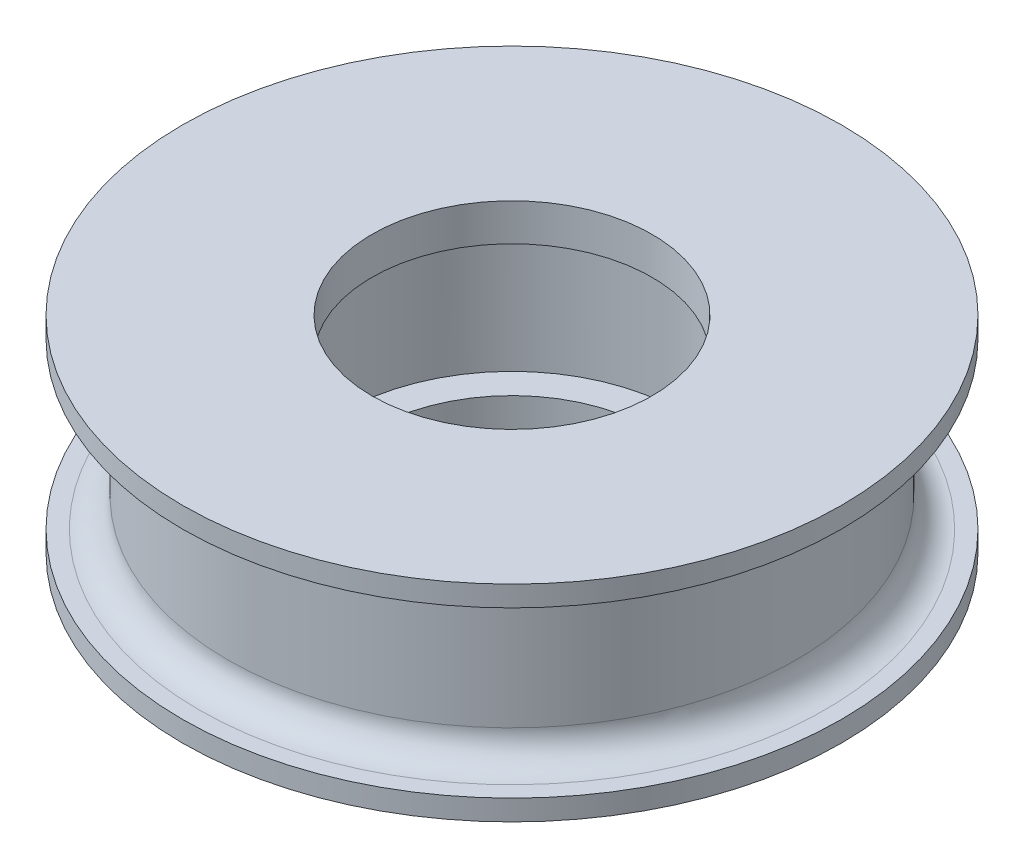
ISO-10303-21;
HEADER;
FILE_DESCRIPTION(('STEP AP214'),'2;1');
FILE_NAME('part.step','',(''),(''),'','','');
FILE_SCHEMA(('AUTOMOTIVE_DESIGN { 1 0 10303 214 1 1 1 1 }'));
ENDSEC;
DATA;
#1=APPLICATION_CONTEXT('core data for automotive mechanical design processes');
#2=APPLICATION_PROTOCOL_DEFINITION('international standard','automotive_design',2000,#1);
#3=PRODUCT_CONTEXT('',#1,'mechanical');
#4=PRODUCT('Part','Part','',(#3));
#5=PRODUCT_RELATED_PRODUCT_CATEGORY('part','',(#4));
#6=PRODUCT_DEFINITION_FORMATION('','',#4);
#7=PRODUCT_DEFINITION_CONTEXT('part definition',#1,'design');
#8=PRODUCT_DEFINITION('design','',#6,#7);
#9=PRODUCT_DEFINITION_SHAPE('','',#8);
#10=(LENGTH_UNIT() NAMED_UNIT(*) SI_UNIT(.MILLI.,.METRE.));
#11=(NAMED_UNIT(*) PLANE_ANGLE_UNIT() SI_UNIT($,.RADIAN.));
#12=(NAMED_UNIT(*) SI_UNIT($,.STERADIAN.) SOLID_ANGLE_UNIT());
#13=UNCERTAINTY_MEASURE_WITH_UNIT(LENGTH_MEASURE(1.E-05),#10,'distance_accuracy_value','');
#14=(GEOMETRIC_REPRESENTATION_CONTEXT(3) GLOBAL_UNCERTAINTY_ASSIGNED_CONTEXT((#13)) GLOBAL_UNIT_ASSIGNED_CONTEXT((#10,
#11,#12)) REPRESENTATION_CONTEXT('',''));
#15=CARTESIAN_POINT('',(0.,0.,0.));
#16=DIRECTION('',(0.,0.,1.));
#17=DIRECTION('',(1.,0.,0.));
#18=AXIS2_PLACEMENT_3D('',#15,#16,#17);
#19=CARTESIAN_POINT('',(0.,15.875,0.));
#20=DIRECTION('',(0.,-1.,0.));
#21=DIRECTION('',(0.,0.,-1.));
#22=AXIS2_PLACEMENT_3D('',#19,#20,#21);
#23=CYLINDRICAL_SURFACE('',#22,13.081);
#24=CARTESIAN_POINT('',(0.,2.8702,0.));
#25=DIRECTION('',(0.,-1.,0.));
#26=DIRECTION('',(0.,0.,-1.));
#27=AXIS2_PLACEMENT_3D('',#24,#25,#26);
#28=CIRCLE('',#27,13.081);
#29=CARTESIAN_POINT('',(0.,2.8702,-13.081));
#30=VERTEX_POINT('',#29);
#31=EDGE_CURVE('E49',#30,#30,#28,.T.);
#32=ORIENTED_EDGE('',*,*,#31,.T.);
#33=EDGE_LOOP('',(#32));
#34=FACE_BOUND('',#33,.T.);
#35=CARTESIAN_POINT('',(0.,13.0048,0.));
#36=DIRECTION('',(0.,1.,0.));
#37=DIRECTION('',(0.,0.,1.));
#38=AXIS2_PLACEMENT_3D('',#35,#36,#37);
#39=CIRCLE('',#38,13.081);
#40=CARTESIAN_POINT('',(0.,13.0048,13.081));
#41=VERTEX_POINT('',#40);
#42=EDGE_CURVE('E36',#41,#41,#39,.T.);
#43=ORIENTED_EDGE('',*,*,#42,.T.);
#44=EDGE_LOOP('',(#43));
#45=FACE_BOUND('',#44,.T.);
#46=ADVANCED_FACE('F32',(#34,#45),#23,.F.);
#47=CARTESIAN_POINT('',(0.,15.875,0.));
#48=DIRECTION('',(0.,-1.,0.));
#49=DIRECTION('',(0.,0.,-1.));
#50=AXIS2_PLACEMENT_3D('',#47,#48,#49);
#51=CYLINDRICAL_SURFACE('',#50,25.4);
#52=CARTESIAN_POINT('',(0.,1.5875,0.));
#53=DIRECTION('',(0.,-1.,0.));
#54=DIRECTION('',(0.,0.,-1.));
#55=AXIS2_PLACEMENT_3D('',#52,#53,#54);
#56=CIRCLE('',#55,25.4);
#57=CARTESIAN_POINT('',(0.,1.5875,-25.4));
#58=VERTEX_POINT('',#57);
#59=EDGE_CURVE('E45',#58,#58,#56,.T.);
#60=ORIENTED_EDGE('',*,*,#59,.T.);
#61=EDGE_LOOP('',(#60));
#62=FACE_BOUND('',#61,.T.);
#63=CARTESIAN_POINT('',(0.,0.,0.));
#64=DIRECTION('',(0.,1.,0.));
#65=DIRECTION('',(0.,0.,1.));
#66=AXIS2_PLACEMENT_3D('',#63,#64,#65);
#67=CIRCLE('',#66,25.4);
#68=CARTESIAN_POINT('',(0.,0.,25.4));
#69=VERTEX_POINT('',#68);
#70=EDGE_CURVE('E40',#69,#69,#67,.T.);
#71=ORIENTED_EDGE('',*,*,#70,.T.);
#72=EDGE_LOOP('',(#71));
#73=FACE_BOUND('',#72,.T.);
#74=ADVANCED_FACE('F83',(#62,#73),#51,.T.);
#75=CARTESIAN_POINT('',(0.,15.875,0.));
#76=DIRECTION('',(0.,1.,0.));
#77=DIRECTION('',(0.,0.,1.));
#78=AXIS2_PLACEMENT_3D('',#75,#76,#77);
#79=PLANE('',#78);
#80=CARTESIAN_POINT('',(0.,15.875,0.));
#81=DIRECTION('',(0.,1.,0.));
#82=DIRECTION('',(0.,0.,1.));
#83=AXIS2_PLACEMENT_3D('',#80,#81,#82);
#84=CIRCLE('',#83,25.4);
#85=CARTESIAN_POINT('',(0.,15.875,25.4));
#86=VERTEX_POINT('',#85);
#87=EDGE_CURVE('E10',#86,#86,#84,.T.);
#88=ORIENTED_EDGE('',*,*,#87,.T.);
#89=EDGE_LOOP('',(#88));
#90=FACE_BOUND('',#89,.T.);
#91=CARTESIAN_POINT('',(0.,15.875,0.));
#92=DIRECTION('',(0.,1.,0.));
#93=DIRECTION('',(0.,0.,1.));
#94=AXIS2_PLACEMENT_3D('',#91,#92,#93);
#95=CIRCLE('',#94,10.795);
#96=CARTESIAN_POINT('',(0.,15.875,10.795));
#97=VERTEX_POINT('',#96);
#98=EDGE_CURVE('E66',#97,#97,#95,.T.);
#99=ORIENTED_EDGE('',*,*,#98,.F.);
#100=EDGE_LOOP('',(#99));
#101=FACE_BOUND('',#100,.T.);
#102=ADVANCED_FACE('F104',(#90,#101),#79,.T.);
#103=CARTESIAN_POINT('',(0.,0.,0.));
#104=DIRECTION('',(0.,1.,0.));
#105=DIRECTION('',(0.,0.,1.));
#106=AXIS2_PLACEMENT_3D('',#103,#104,#105);
#107=PLANE('',#106);
#108=ORIENTED_EDGE('',*,*,#70,.F.);
#109=EDGE_LOOP('',(#108));
#110=FACE_BOUND('',#109,.T.);
#111=CARTESIAN_POINT('',(0.,0.,0.));
#112=DIRECTION('',(0.,-1.,0.));
#113=DIRECTION('',(0.,0.,-1.));
#114=AXIS2_PLACEMENT_3D('',#111,#112,#113);
#115=CIRCLE('',#114,10.795);
#116=CARTESIAN_POINT('',(0.,0.,-10.795));
#117=VERTEX_POINT('',#116);
#118=EDGE_CURVE('E59',#117,#117,#115,.T.);
#119=ORIENTED_EDGE('',*,*,#118,.F.);
#120=EDGE_LOOP('',(#119));
#121=FACE_BOUND('',#120,.T.);
#122=ADVANCED_FACE('F97',(#110,#121),#107,.F.);
#123=CARTESIAN_POINT('',(0.,14.2875,0.));
#124=DIRECTION('',(0.,-1.,0.));
#125=DIRECTION('',(0.,0.,-1.));
#126=AXIS2_PLACEMENT_3D('',#123,#124,#125);
#127=CIRCLE('',#126,25.4);
#128=CARTESIAN_POINT('',(0.,14.2875,-25.4));
#129=VERTEX_POINT('',#128);
#130=EDGE_CURVE('E51',#129,#129,#127,.T.);
#131=ORIENTED_EDGE('',*,*,#130,.F.);
#132=EDGE_LOOP('',(#131));
#133=FACE_BOUND('',#132,.T.);
#134=ORIENTED_EDGE('',*,*,#87,.F.);
#135=EDGE_LOOP('',(#134));
#136=FACE_BOUND('',#135,.T.);
#137=ADVANCED_FACE('F34',(#133,#136),#51,.T.);
#138=CARTESIAN_POINT('',(25.4,1.5875,0.));
#139=DIRECTION('',(0.,-1.,0.));
#140=DIRECTION('',(0.,0.,-1.));
#141=AXIS2_PLACEMENT_3D('',#138,#139,#140);
#142=PLANE('',#141);
#143=ORIENTED_EDGE('',*,*,#59,.F.);
#144=EDGE_LOOP('',(#143));
#145=FACE_BOUND('',#144,.T.);
#146=CARTESIAN_POINT('',(0.,1.5875,0.));
#147=DIRECTION('',(0.,-1.,0.));
#148=DIRECTION('',(0.,0.,-1.));
#149=AXIS2_PLACEMENT_3D('',#146,#147,#148);
#150=CIRCLE('',#149,24.13);
#151=CARTESIAN_POINT('',(0.,1.5875,-24.13));
#152=VERTEX_POINT('',#151);
#153=EDGE_CURVE('E76',#152,#152,#150,.T.);
#154=ORIENTED_EDGE('',*,*,#153,.T.);
#155=EDGE_LOOP('',(#154));
#156=FACE_BOUND('',#155,.T.);
#157=ADVANCED_FACE('F86',(#145,#156),#142,.F.);
#158=CARTESIAN_POINT('',(0.,3.81,0.));
#159=DIRECTION('',(0.,-1.,0.));
#160=DIRECTION('',(0.,0.,-1.));
#161=AXIS2_PLACEMENT_3D('',#158,#159,#160);
#162=TOROIDAL_SURFACE('',#161,24.13,2.2225);
#163=ORIENTED_EDGE('',*,*,#153,.F.);
#164=EDGE_LOOP('',(#163));
#165=FACE_BOUND('',#164,.T.);
#166=CARTESIAN_POINT('',(0.,3.81,0.));
#167=DIRECTION('',(0.,-1.,0.));
#168=DIRECTION('',(0.,0.,-1.));
#169=AXIS2_PLACEMENT_3D('',#166,#167,#168);
#170=CIRCLE('',#169,21.9075);
#171=CARTESIAN_POINT('',(0.,3.81,-21.9075));
#172=VERTEX_POINT('',#171);
#173=EDGE_CURVE('E74',#172,#172,#170,.T.);
#174=ORIENTED_EDGE('',*,*,#173,.T.);
#175=EDGE_LOOP('',(#174));
#176=FACE_BOUND('',#175,.T.);
#177=ADVANCED_FACE('F88',(#165,#176),#162,.F.);
#178=CARTESIAN_POINT('',(0.,0.,0.));
#179=DIRECTION('',(0.,-1.,0.));
#180=DIRECTION('',(0.,0.,-1.));
#181=AXIS2_PLACEMENT_3D('',#178,#179,#180);
#182=CYLINDRICAL_SURFACE('',#181,21.9075);
#183=ORIENTED_EDGE('',*,*,#173,.F.);
#184=EDGE_LOOP('',(#183));
#185=FACE_BOUND('',#184,.T.);
#186=CARTESIAN_POINT('',(0.,12.065,0.));
#187=DIRECTION('',(0.,-1.,0.));
#188=DIRECTION('',(0.,0.,-1.));
#189=AXIS2_PLACEMENT_3D('',#186,#187,#188);
#190=CIRCLE('',#189,21.9075);
#191=CARTESIAN_POINT('',(0.,12.065,-21.9075));
#192=VERTEX_POINT('',#191);
#193=EDGE_CURVE('E71',#192,#192,#190,.T.);
#194=ORIENTED_EDGE('',*,*,#193,.T.);
#195=EDGE_LOOP('',(#194));
#196=FACE_BOUND('',#195,.T.);
#197=ADVANCED_FACE('F94',(#185,#196),#182,.T.);
#198=CARTESIAN_POINT('',(0.,12.065,0.));
#199=DIRECTION('',(0.,-1.,0.));
#200=DIRECTION('',(0.,0.,-1.));
#201=AXIS2_PLACEMENT_3D('',#198,#199,#200);
#202=TOROIDAL_SURFACE('',#201,24.13,2.2225);
#203=ORIENTED_EDGE('',*,*,#193,.F.);
#204=EDGE_LOOP('',(#203));
#205=FACE_BOUND('',#204,.T.);
#206=CARTESIAN_POINT('',(0.,14.2875,0.));
#207=DIRECTION('',(0.,-1.,0.));
#208=DIRECTION('',(0.,0.,-1.));
#209=AXIS2_PLACEMENT_3D('',#206,#207,#208);
#210=CIRCLE('',#209,24.13);
#211=CARTESIAN_POINT('',(0.,14.2875,-24.13));
#212=VERTEX_POINT('',#211);
#213=EDGE_CURVE('E56',#212,#212,#210,.T.);
#214=ORIENTED_EDGE('',*,*,#213,.T.);
#215=EDGE_LOOP('',(#214));
#216=FACE_BOUND('',#215,.T.);
#217=ADVANCED_FACE('F135',(#205,#216),#202,.F.);
#218=CARTESIAN_POINT('',(25.4,14.2875,0.));
#219=DIRECTION('',(0.,1.,0.));
#220=DIRECTION('',(0.,0.,1.));
#221=AXIS2_PLACEMENT_3D('',#218,#219,#220);
#222=PLANE('',#221);
#223=ORIENTED_EDGE('',*,*,#213,.F.);
#224=EDGE_LOOP('',(#223));
#225=FACE_BOUND('',#224,.T.);
#226=ORIENTED_EDGE('',*,*,#130,.T.);
#227=EDGE_LOOP('',(#226));
#228=FACE_BOUND('',#227,.T.);
#229=ADVANCED_FACE('F129',(#225,#228),#222,.F.);
#230=CARTESIAN_POINT('',(0.,2.8702,0.));
#231=DIRECTION('',(0.,-1.,0.));
#232=DIRECTION('',(0.,0.,-1.));
#233=AXIS2_PLACEMENT_3D('',#230,#231,#232);
#234=PLANE('',#233);
#235=CARTESIAN_POINT('',(0.,2.8702,0.));
#236=DIRECTION('',(0.,-1.,0.));
#237=DIRECTION('',(0.,0.,-1.));
#238=AXIS2_PLACEMENT_3D('',#235,#236,#237);
#239=CIRCLE('',#238,10.795);
#240=CARTESIAN_POINT('',(0.,2.8702,-10.795));
#241=VERTEX_POINT('',#240);
#242=EDGE_CURVE('E52',#241,#241,#239,.T.);
#243=ORIENTED_EDGE('',*,*,#242,.T.);
#244=EDGE_LOOP('',(#243));
#245=FACE_BOUND('',#244,.T.);
#246=ORIENTED_EDGE('',*,*,#31,.F.);
#247=EDGE_LOOP('',(#246));
#248=FACE_BOUND('',#247,.T.);
#249=ADVANCED_FACE('F119',(#245,#248),#234,.F.);
#250=CARTESIAN_POINT('',(0.,2.8702,0.));
#251=DIRECTION('',(0.,-1.,0.));
#252=DIRECTION('',(0.,0.,-1.));
#253=AXIS2_PLACEMENT_3D('',#250,#251,#252);
#254=CYLINDRICAL_SURFACE('',#253,10.795);
#255=CARTESIAN_POINT('',(0.,2.8702,-10.795));
#256=CARTESIAN_POINT('',(0.,2.84030208333333,-10.795));
#257=CARTESIAN_POINT('',(0.,2.81040416666667,-10.795));
#258=CARTESIAN_POINT('',(0.,2.75060833333333,-10.795));
#259=CARTESIAN_POINT('',(0.,2.72071041666667,-10.795));
#260=CARTESIAN_POINT('',(0.,2.66091458333333,-10.795));
#261=CARTESIAN_POINT('',(0.,2.63101666666667,-10.795));
#262=CARTESIAN_POINT('',(0.,2.57122083333333,-10.795));
#263=CARTESIAN_POINT('',(0.,2.54132291666667,-10.795));
#264=CARTESIAN_POINT('',(0.,2.48152708333333,-10.795));
#265=CARTESIAN_POINT('',(0.,2.45162916666667,-10.795));
#266=CARTESIAN_POINT('',(0.,2.39183333333333,-10.795));
#267=CARTESIAN_POINT('',(0.,2.36193541666667,-10.795));
#268=CARTESIAN_POINT('',(0.,2.30213958333333,-10.795));
#269=CARTESIAN_POINT('',(0.,2.27224166666667,-10.795));
#270=CARTESIAN_POINT('',(0.,2.21244583333333,-10.795));
#271=CARTESIAN_POINT('',(0.,2.18254791666667,-10.795));
#272=CARTESIAN_POINT('',(0.,2.12275208333333,-10.795));
#273=CARTESIAN_POINT('',(0.,2.09285416666667,-10.795));
#274=CARTESIAN_POINT('',(0.,2.03305833333333,-10.795));
#275=CARTESIAN_POINT('',(0.,2.00316041666667,-10.795));
#276=CARTESIAN_POINT('',(0.,1.94336458333333,-10.795));
#277=CARTESIAN_POINT('',(0.,1.91346666666667,-10.795));
#278=CARTESIAN_POINT('',(0.,1.85367083333333,-10.795));
#279=CARTESIAN_POINT('',(0.,1.82377291666667,-10.795));
#280=CARTESIAN_POINT('',(0.,1.76397708333333,-10.795));
#281=CARTESIAN_POINT('',(0.,1.73407916666667,-10.795));
#282=CARTESIAN_POINT('',(0.,1.67428333333333,-10.795));
#283=CARTESIAN_POINT('',(0.,1.64438541666667,-10.795));
#284=CARTESIAN_POINT('',(0.,1.58458958333333,-10.795));
#285=CARTESIAN_POINT('',(0.,1.55469166666667,-10.795));
#286=CARTESIAN_POINT('',(0.,1.49489583333333,-10.795));
#287=CARTESIAN_POINT('',(0.,1.46499791666667,-10.795));
#288=CARTESIAN_POINT('',(0.,1.40520208333333,-10.795));
#289=CARTESIAN_POINT('',(0.,1.37530416666667,-10.795));
#290=CARTESIAN_POINT('',(0.,1.31550833333333,-10.795));
#291=CARTESIAN_POINT('',(0.,1.28561041666667,-10.795));
#292=CARTESIAN_POINT('',(0.,1.22581458333333,-10.795));
#293=CARTESIAN_POINT('',(0.,1.19591666666667,-10.795));
#294=CARTESIAN_POINT('',(0.,1.13612083333333,-10.795));
#295=CARTESIAN_POINT('',(0.,1.10622291666667,-10.795));
#296=CARTESIAN_POINT('',(0.,1.04642708333333,-10.795));
#297=CARTESIAN_POINT('',(0.,1.01652916666667,-10.795));
#298=CARTESIAN_POINT('',(0.,0.956733333333334,-10.795));
#299=CARTESIAN_POINT('',(0.,0.926835416666667,-10.795));
#300=CARTESIAN_POINT('',(0.,0.867039583333334,-10.795));
#301=CARTESIAN_POINT('',(0.,0.837141666666667,-10.795));
#302=CARTESIAN_POINT('',(0.,0.777345833333334,-10.795));
#303=CARTESIAN_POINT('',(0.,0.747447916666667,-10.795));
#304=CARTESIAN_POINT('',(0.,0.687652083333334,-10.795));
#305=CARTESIAN_POINT('',(0.,0.657754166666667,-10.795));
#306=CARTESIAN_POINT('',(0.,0.597958333333334,-10.795));
#307=CARTESIAN_POINT('',(0.,0.568060416666667,-10.795));
#308=CARTESIAN_POINT('',(0.,0.508264583333334,-10.795));
#309=CARTESIAN_POINT('',(0.,0.478366666666667,-10.795));
#310=CARTESIAN_POINT('',(0.,0.418570833333334,-10.795));
#311=CARTESIAN_POINT('',(0.,0.388672916666667,-10.795));
#312=CARTESIAN_POINT('',(0.,0.328877083333334,-10.795));
#313=CARTESIAN_POINT('',(0.,0.298979166666667,-10.795));
#314=CARTESIAN_POINT('',(0.,0.239183333333334,-10.795));
#315=CARTESIAN_POINT('',(0.,0.209285416666667,-10.795));
#316=CARTESIAN_POINT('',(0.,0.149489583333334,-10.795));
#317=CARTESIAN_POINT('',(0.,0.119591666666667,-10.795));
#318=CARTESIAN_POINT('',(0.,0.0597958333333338,-10.795));
#319=CARTESIAN_POINT('',(0.,0.0298979166666671,-10.795));
#320=CARTESIAN_POINT('',(0.,0.,-10.795));
#321=B_SPLINE_CURVE_WITH_KNOTS('',3,(#255,#256,#257,#258,#259,#260,#261,#262,#263,#264,#265,
#266,#267,#268,#269,#270,#271,#272,#273,#274,#275,#276,#277,#278,#279,#280,#281,#282,#283,#284,
#285,#286,#287,#288,#289,#290,#291,#292,#293,#294,#295,#296,#297,#298,#299,#300,#301,#302,#303,
#304,#305,#306,#307,#308,#309,#310,#311,#312,#313,#314,#315,#316,#317,#318,#319,#320),
.UNSPECIFIED.,.F.,.F.,(4,2,2,2,2,2,2,2,2,2,2,2,2,2,2,2,2,2,2,2,2,2,2,2,2,2,2,2,2,2,2,2,4),(0.,
0.0896937499999997,0.1793875,0.26908125,0.358775,0.44846875,0.5381625,0.627856249999999,0.71755,
0.80724375,0.8969375,0.986631249999999,1.076325,1.16601875,1.2557125,1.34540625,1.4351,
1.52479375,1.6144875,1.70418125,1.793875,1.88356875,1.9732625,2.06295625,2.15265,2.24234375,
2.3320375,2.42173125,2.511425,2.60111875,2.6908125,2.78050625,2.8702),.UNSPECIFIED.);
#322=EDGE_CURVE('BSEAM116',#241,#117,#321,.T.);
#323=ORIENTED_EDGE('',*,*,#242,.F.);
#324=ORIENTED_EDGE('',*,*,#118,.T.);
#325=ORIENTED_EDGE('',*,*,#322,.T.);
#326=ORIENTED_EDGE('',*,*,#322,.F.);
#327=EDGE_LOOP('',(#323,#325,#324,#326));
#328=FACE_BOUND('',#327,.T.);
#329=ADVANCED_FACE('F116',(#328),#254,.F.);
#330=CARTESIAN_POINT('',(0.,13.0048,0.));
#331=DIRECTION('',(0.,1.,0.));
#332=DIRECTION('',(0.,0.,1.));
#333=AXIS2_PLACEMENT_3D('',#330,#331,#332);
#334=PLANE('',#333);
#335=CARTESIAN_POINT('',(0.,13.0048,0.));
#336=DIRECTION('',(0.,1.,0.));
#337=DIRECTION('',(0.,0.,1.));
#338=AXIS2_PLACEMENT_3D('',#335,#336,#337);
#339=CIRCLE('',#338,10.795);
#340=CARTESIAN_POINT('',(0.,13.0048,10.795));
#341=VERTEX_POINT('',#340);
#342=EDGE_CURVE('E205',#341,#341,#339,.T.);
#343=ORIENTED_EDGE('',*,*,#342,.T.);
#344=EDGE_LOOP('',(#343));
#345=FACE_BOUND('',#344,.T.);
#346=ORIENTED_EDGE('',*,*,#42,.F.);
#347=EDGE_LOOP('',(#346));
#348=FACE_BOUND('',#347,.T.);
#349=ADVANCED_FACE('F118',(#345,#348),#334,.F.);
#350=CARTESIAN_POINT('',(0.,13.0048,0.));
#351=DIRECTION('',(0.,1.,0.));
#352=DIRECTION('',(0.,0.,1.));
#353=AXIS2_PLACEMENT_3D('',#350,#351,#352);
#354=CYLINDRICAL_SURFACE('',#353,10.795);
#355=CARTESIAN_POINT('',(0.,13.0048,10.795));
#356=CARTESIAN_POINT('',(0.,13.0346979166667,10.795));
#357=CARTESIAN_POINT('',(0.,13.0645958333333,10.795));
#358=CARTESIAN_POINT('',(0.,13.1243916666667,10.795));
#359=CARTESIAN_POINT('',(0.,13.1542895833333,10.795));
#360=CARTESIAN_POINT('',(0.,13.2140854166667,10.795));
#361=CARTESIAN_POINT('',(0.,13.2439833333333,10.795));
#362=CARTESIAN_POINT('',(0.,13.3037791666667,10.795));
#363=CARTESIAN_POINT('',(0.,13.3336770833333,10.795));
#364=CARTESIAN_POINT('',(0.,13.3934729166667,10.795));
#365=CARTESIAN_POINT('',(0.,13.4233708333333,10.795));
#366=CARTESIAN_POINT('',(0.,13.4831666666667,10.795));
#367=CARTESIAN_POINT('',(0.,13.5130645833333,10.795));
#368=CARTESIAN_POINT('',(0.,13.5728604166667,10.795));
#369=CARTESIAN_POINT('',(0.,13.6027583333333,10.795));
#370=CARTESIAN_POINT('',(0.,13.6625541666667,10.795));
#371=CARTESIAN_POINT('',(0.,13.6924520833333,10.795));
#372=CARTESIAN_POINT('',(0.,13.7522479166667,10.795));
#373=CARTESIAN_POINT('',(0.,13.7821458333333,10.795));
#374=CARTESIAN_POINT('',(0.,13.8419416666667,10.795));
#375=CARTESIAN_POINT('',(0.,13.8718395833333,10.795));
#376=CARTESIAN_POINT('',(0.,13.9316354166667,10.795));
#377=CARTESIAN_POINT('',(0.,13.9615333333333,10.795));
#378=CARTESIAN_POINT('',(0.,14.0213291666667,10.795));
#379=CARTESIAN_POINT('',(0.,14.0512270833333,10.795));
#380=CARTESIAN_POINT('',(0.,14.1110229166667,10.795));
#381=CARTESIAN_POINT('',(0.,14.1409208333333,10.795));
#382=CARTESIAN_POINT('',(0.,14.2007166666667,10.795));
#383=CARTESIAN_POINT('',(0.,14.2306145833333,10.795));
#384=CARTESIAN_POINT('',(0.,14.2904104166667,10.795));
#385=CARTESIAN_POINT('',(0.,14.3203083333333,10.795));
#386=CARTESIAN_POINT('',(0.,14.3801041666667,10.795));
#387=CARTESIAN_POINT('',(0.,14.4100020833333,10.795));
#388=CARTESIAN_POINT('',(0.,14.4697979166667,10.795));
#389=CARTESIAN_POINT('',(0.,14.4996958333333,10.795));
#390=CARTESIAN_POINT('',(0.,14.5594916666667,10.795));
#391=CARTESIAN_POINT('',(0.,14.5893895833333,10.795));
#392=CARTESIAN_POINT('',(0.,14.6491854166667,10.795));
#393=CARTESIAN_POINT('',(0.,14.6790833333333,10.795));
#394=CARTESIAN_POINT('',(0.,14.7388791666667,10.795));
#395=CARTESIAN_POINT('',(0.,14.7687770833333,10.795));
#396=CARTESIAN_POINT('',(0.,14.8285729166667,10.795));
#397=CARTESIAN_POINT('',(0.,14.8584708333333,10.795));
#398=CARTESIAN_POINT('',(0.,14.9182666666667,10.795));
#399=CARTESIAN_POINT('',(0.,14.9481645833333,10.795));
#400=CARTESIAN_POINT('',(0.,15.0079604166667,10.795));
#401=CARTESIAN_POINT('',(0.,15.0378583333333,10.795));
#402=CARTESIAN_POINT('',(0.,15.0976541666667,10.795));
#403=CARTESIAN_POINT('',(0.,15.1275520833333,10.795));
#404=CARTESIAN_POINT('',(0.,15.1873479166667,10.795));
#405=CARTESIAN_POINT('',(0.,15.2172458333333,10.795));
#406=CARTESIAN_POINT('',(0.,15.2770416666667,10.795));
#407=CARTESIAN_POINT('',(0.,15.3069395833333,10.795));
#408=CARTESIAN_POINT('',(0.,15.3667354166667,10.795));
#409=CARTESIAN_POINT('',(0.,15.3966333333333,10.795));
#410=CARTESIAN_POINT('',(0.,15.4564291666667,10.795));
#411=CARTESIAN_POINT('',(0.,15.4863270833333,10.795));
#412=CARTESIAN_POINT('',(0.,15.5461229166667,10.795));
#413=CARTESIAN_POINT('',(0.,15.5760208333333,10.795));
#414=CARTESIAN_POINT('',(0.,15.6358166666667,10.795));
#415=CARTESIAN_POINT('',(0.,15.6657145833333,10.795));
#416=CARTESIAN_POINT('',(0.,15.7255104166667,10.795));
#417=CARTESIAN_POINT('',(0.,15.7554083333333,10.795));
#418=CARTESIAN_POINT('',(0.,15.8152041666667,10.795));
#419=CARTESIAN_POINT('',(0.,15.8451020833333,10.795));
#420=CARTESIAN_POINT('',(0.,15.875,10.795));
#421=B_SPLINE_CURVE_WITH_KNOTS('',3,(#355,#356,#357,#358,#359,#360,#361,#362,#363,#364,#365,
#366,#367,#368,#369,#370,#371,#372,#373,#374,#375,#376,#377,#378,#379,#380,#381,#382,#383,#384,
#385,#386,#387,#388,#389,#390,#391,#392,#393,#394,#395,#396,#397,#398,#399,#400,#401,#402,#403,
#404,#405,#406,#407,#408,#409,#410,#411,#412,#413,#414,#415,#416,#417,#418,#419,#420),
.UNSPECIFIED.,.F.,.F.,(4,2,2,2,2,2,2,2,2,2,2,2,2,2,2,2,2,2,2,2,2,2,2,2,2,2,2,2,2,2,2,2,4),(0.,
0.0896937500000014,0.179387500000001,0.269081250000001,0.358775,0.44846875,0.5381625,
0.627856250000001,0.717550000000001,0.80724375,0.8969375,0.98663125,1.076325,1.16601875,
1.2557125,1.34540625,1.4351,1.52479375,1.6144875,1.70418125,1.793875,1.88356875,1.9732625,
2.06295625,2.15265,2.24234375,2.3320375,2.42173125,2.511425,2.60111875,2.6908125,2.78050625,
2.8702),.UNSPECIFIED.);
#422=EDGE_CURVE('BSEAM126',#341,#97,#421,.T.);
#423=ORIENTED_EDGE('',*,*,#342,.F.);
#424=ORIENTED_EDGE('',*,*,#98,.T.);
#425=ORIENTED_EDGE('',*,*,#422,.T.);
#426=ORIENTED_EDGE('',*,*,#422,.F.);
#427=EDGE_LOOP('',(#423,#425,#424,#426));
#428=FACE_BOUND('',#427,.T.);
#429=ADVANCED_FACE('F126',(#428),#354,.F.);
#430=CLOSED_SHELL('',(#46,#74,#102,#122,#137,#157,#177,#197,#217,#229,#249,#329,#349,#429));
#431=MANIFOLD_SOLID_BREP('B2',#430);
#432=ADVANCED_BREP_SHAPE_REPRESENTATION('',(#18,#431),#14);
#433=SHAPE_DEFINITION_REPRESENTATION(#9,#432);
ENDSEC;
END-ISO-10303-21;
